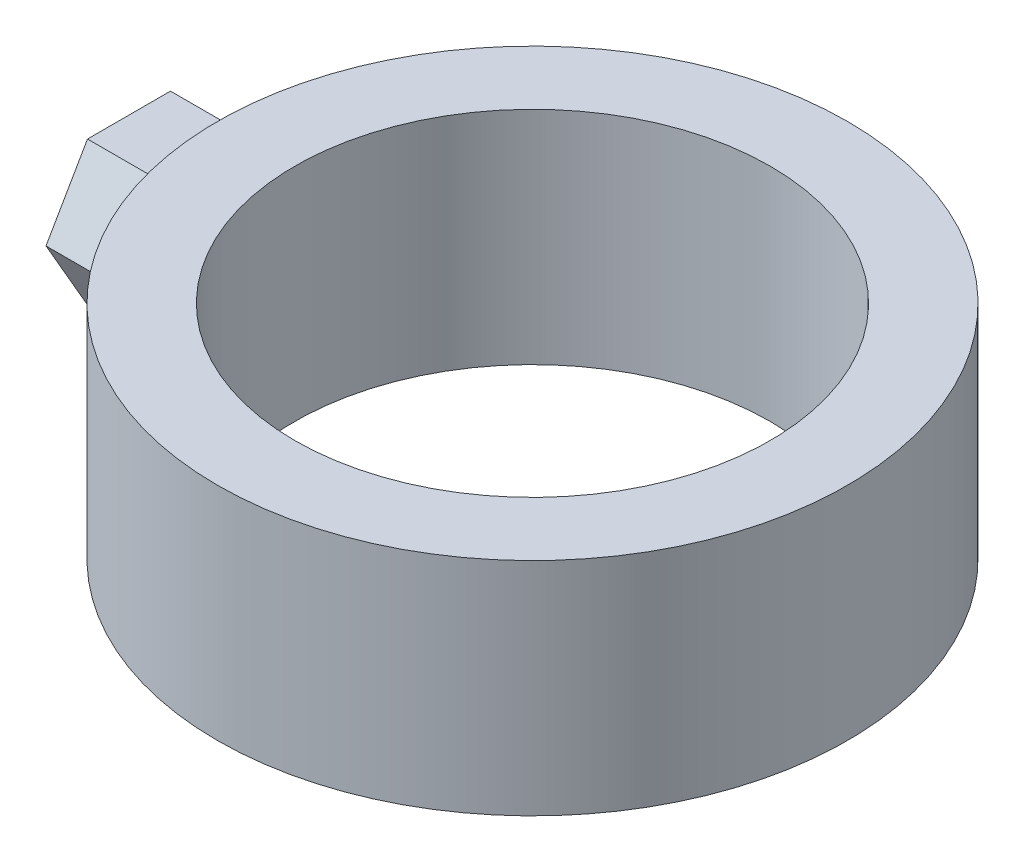
ISO-10303-21;
HEADER;
FILE_DESCRIPTION(('STEP AP214'),'2;1');
FILE_NAME('part.step','',(''),(''),'','','');
FILE_SCHEMA(('AUTOMOTIVE_DESIGN { 1 0 10303 214 1 1 1 1 }'));
ENDSEC;
DATA;
#1=APPLICATION_CONTEXT('core data for automotive mechanical design processes');
#2=APPLICATION_PROTOCOL_DEFINITION('international standard','automotive_design',2000,#1);
#3=PRODUCT_CONTEXT('',#1,'mechanical');
#4=PRODUCT('Part','Part','',(#3));
#5=PRODUCT_RELATED_PRODUCT_CATEGORY('part','',(#4));
#6=PRODUCT_DEFINITION_FORMATION('','',#4);
#7=PRODUCT_DEFINITION_CONTEXT('part definition',#1,'design');
#8=PRODUCT_DEFINITION('design','',#6,#7);
#9=PRODUCT_DEFINITION_SHAPE('','',#8);
#10=(LENGTH_UNIT() NAMED_UNIT(*) SI_UNIT(.MILLI.,.METRE.));
#11=(NAMED_UNIT(*) PLANE_ANGLE_UNIT() SI_UNIT($,.RADIAN.));
#12=(NAMED_UNIT(*) SI_UNIT($,.STERADIAN.) SOLID_ANGLE_UNIT());
#13=UNCERTAINTY_MEASURE_WITH_UNIT(LENGTH_MEASURE(1.E-05),#10,'distance_accuracy_value','');
#14=(GEOMETRIC_REPRESENTATION_CONTEXT(3) GLOBAL_UNCERTAINTY_ASSIGNED_CONTEXT((#13)) GLOBAL_UNIT_ASSIGNED_CONTEXT((#10,
#11,#12)) REPRESENTATION_CONTEXT('',''));
#15=CARTESIAN_POINT('',(0.,0.,0.));
#16=DIRECTION('',(0.,0.,1.));
#17=DIRECTION('',(1.,0.,0.));
#18=AXIS2_PLACEMENT_3D('',#15,#16,#17);
#19=CARTESIAN_POINT('',(0.,10.,0.));
#20=DIRECTION('',(0.,1.,0.));
#21=DIRECTION('',(0.,0.,1.));
#22=AXIS2_PLACEMENT_3D('',#19,#20,#21);
#23=PLANE('',#22);
#24=CARTESIAN_POINT('',(0.,10.,0.));
#25=DIRECTION('',(0.,1.,0.));
#26=DIRECTION('',(0.,0.,1.));
#27=AXIS2_PLACEMENT_3D('',#24,#25,#26);
#28=CIRCLE('',#27,28.5);
#29=CARTESIAN_POINT('',(0.,10.,28.5));
#30=VERTEX_POINT('',#29);
#31=EDGE_CURVE('E139',#30,#30,#28,.T.);
#32=ORIENTED_EDGE('',*,*,#31,.T.);
#33=EDGE_LOOP('',(#32));
#34=FACE_BOUND('',#33,.T.);
#35=CARTESIAN_POINT('',(0.,10.,0.));
#36=DIRECTION('',(0.,1.,0.));
#37=DIRECTION('',(0.,0.,1.));
#38=AXIS2_PLACEMENT_3D('',#35,#36,#37);
#39=CIRCLE('',#38,21.5);
#40=CARTESIAN_POINT('',(0.,10.,21.5));
#41=VERTEX_POINT('',#40);
#42=EDGE_CURVE('E133',#41,#41,#39,.T.);
#43=ORIENTED_EDGE('',*,*,#42,.F.);
#44=EDGE_LOOP('',(#43));
#45=FACE_BOUND('',#44,.T.);
#46=ADVANCED_FACE('F35',(#34,#45),#23,.T.);
#47=CARTESIAN_POINT('',(0.,-10.,0.));
#48=DIRECTION('',(0.,1.,0.));
#49=DIRECTION('',(0.,0.,1.));
#50=AXIS2_PLACEMENT_3D('',#47,#48,#49);
#51=PLANE('',#50);
#52=CARTESIAN_POINT('',(0.,-10.,0.));
#53=DIRECTION('',(0.,1.,0.));
#54=DIRECTION('',(0.,0.,1.));
#55=AXIS2_PLACEMENT_3D('',#52,#53,#54);
#56=CIRCLE('',#55,28.5);
#57=CARTESIAN_POINT('',(0.,-10.,28.5));
#58=VERTEX_POINT('',#57);
#59=EDGE_CURVE('E136',#58,#58,#56,.T.);
#60=ORIENTED_EDGE('',*,*,#59,.F.);
#61=EDGE_LOOP('',(#60));
#62=FACE_BOUND('',#61,.T.);
#63=CARTESIAN_POINT('',(0.,-10.,0.));
#64=DIRECTION('',(0.,1.,0.));
#65=DIRECTION('',(0.,0.,1.));
#66=AXIS2_PLACEMENT_3D('',#63,#64,#65);
#67=CIRCLE('',#66,21.5);
#68=CARTESIAN_POINT('',(0.,-10.,21.5));
#69=VERTEX_POINT('',#68);
#70=EDGE_CURVE('E122',#69,#69,#67,.T.);
#71=ORIENTED_EDGE('',*,*,#70,.T.);
#72=EDGE_LOOP('',(#71));
#73=FACE_BOUND('',#72,.T.);
#74=ADVANCED_FACE('F174',(#62,#73),#51,.F.);
#75=CARTESIAN_POINT('',(0.,10.,0.));
#76=DIRECTION('',(0.,-1.,0.));
#77=DIRECTION('',(0.,0.,-1.));
#78=AXIS2_PLACEMENT_3D('',#75,#76,#77);
#79=CYLINDRICAL_SURFACE('',#78,28.5);
#80=CARTESIAN_POINT('',(0.,-6.5,0.));
#81=DIRECTION('',(0.,-1.,0.));
#82=DIRECTION('',(0.,0.,-1.));
#83=AXIS2_PLACEMENT_3D('',#80,#81,#82);
#84=CIRCLE('',#83,28.5);
#85=CARTESIAN_POINT('',(-28.2518435976604,-6.5,3.75277674973257));
#86=VERTEX_POINT('',#85);
#87=CARTESIAN_POINT('',(-28.2518435976604,-6.5,-3.75277674973257));
#88=VERTEX_POINT('',#87);
#89=EDGE_CURVE('E43',#86,#88,#84,.T.);
#90=ORIENTED_EDGE('',*,*,#89,.T.);
#91=CARTESIAN_POINT('',(0.,-13.,0.));
#92=DIRECTION('',(0.,-0.5,-0.866025403784439));
#93=DIRECTION('',(0.,-0.866025403784439,0.5));
#94=AXIS2_PLACEMENT_3D('',#91,#92,#93);
#95=ELLIPSE('',#94,57.,28.5);
#96=CARTESIAN_POINT('',(-27.4939387259568,0.,-7.50555349946513));
#97=VERTEX_POINT('',#96);
#98=EDGE_CURVE('E11',#88,#97,#95,.T.);
#99=ORIENTED_EDGE('',*,*,#98,.T.);
#100=CARTESIAN_POINT('',(0.,13.,0.));
#101=DIRECTION('',(0.,0.5,-0.866025403784438));
#102=DIRECTION('',(0.,-0.866025403784439,-0.5));
#103=AXIS2_PLACEMENT_3D('',#100,#101,#102);
#104=ELLIPSE('',#103,57.,28.5);
#105=CARTESIAN_POINT('',(-28.2518435976604,6.5,-3.75277674973257));
#106=VERTEX_POINT('',#105);
#107=EDGE_CURVE('E89',#97,#106,#104,.T.);
#108=ORIENTED_EDGE('',*,*,#107,.T.);
#109=CARTESIAN_POINT('',(0.,6.5,0.));
#110=DIRECTION('',(0.,1.,0.));
#111=DIRECTION('',(0.,0.,1.));
#112=AXIS2_PLACEMENT_3D('',#109,#110,#111);
#113=CIRCLE('',#112,28.5);
#114=CARTESIAN_POINT('',(-28.2518435976604,6.5,3.75277674973257));
#115=VERTEX_POINT('',#114);
#116=EDGE_CURVE('E145',#106,#115,#113,.T.);
#117=ORIENTED_EDGE('',*,*,#116,.T.);
#118=CARTESIAN_POINT('',(0.,13.,0.));
#119=DIRECTION('',(0.,0.5,0.866025403784439));
#120=DIRECTION('',(0.,-0.866025403784439,0.5));
#121=AXIS2_PLACEMENT_3D('',#118,#119,#120);
#122=ELLIPSE('',#121,57.,28.5);
#123=CARTESIAN_POINT('',(-27.4939387259568,0.,7.50555349946513));
#124=VERTEX_POINT('',#123);
#125=EDGE_CURVE('E148',#115,#124,#122,.T.);
#126=ORIENTED_EDGE('',*,*,#125,.T.);
#127=CARTESIAN_POINT('',(0.,-13.,0.));
#128=DIRECTION('',(0.,-0.5,0.866025403784439));
#129=DIRECTION('',(0.,-0.866025403784439,-0.5));
#130=AXIS2_PLACEMENT_3D('',#127,#128,#129);
#131=ELLIPSE('',#130,57.,28.5);
#132=EDGE_CURVE('E151',#124,#86,#131,.T.);
#133=ORIENTED_EDGE('',*,*,#132,.T.);
#134=EDGE_LOOP('',(#90,#99,#108,#117,#126,#133));
#135=FACE_BOUND('',#134,.T.);
#136=ORIENTED_EDGE('',*,*,#31,.F.);
#137=EDGE_LOOP('',(#136));
#138=FACE_BOUND('',#137,.T.);
#139=ORIENTED_EDGE('',*,*,#59,.T.);
#140=EDGE_LOOP('',(#139));
#141=FACE_BOUND('',#140,.T.);
#142=ADVANCED_FACE('F37',(#135,#138,#141),#79,.T.);
#143=CARTESIAN_POINT('',(0.,10.,0.));
#144=DIRECTION('',(0.,-1.,0.));
#145=DIRECTION('',(0.,0.,-1.));
#146=AXIS2_PLACEMENT_3D('',#143,#144,#145);
#147=CYLINDRICAL_SURFACE('',#146,21.5);
#148=ORIENTED_EDGE('',*,*,#42,.T.);
#149=EDGE_LOOP('',(#148));
#150=FACE_BOUND('',#149,.T.);
#151=ORIENTED_EDGE('',*,*,#70,.F.);
#152=EDGE_LOOP('',(#151));
#153=FACE_BOUND('',#152,.T.);
#154=ADVANCED_FACE('F183',(#150,#153),#147,.F.);
#155=CARTESIAN_POINT('',(-36.5,-6.5,-3.75277674973257));
#156=DIRECTION('',(0.,-0.5,-0.866025403784439));
#157=DIRECTION('',(0.,0.866025403784439,-0.5));
#158=AXIS2_PLACEMENT_3D('',#155,#156,#157);
#159=PLANE('',#158);
#160=ORIENTED_EDGE('',*,*,#98,.F.);
#161=DIRECTION('',(1.,0.,0.));
#162=VECTOR('',#161,1.);
#163=CARTESIAN_POINT('',(-36.5,-6.5,-3.75277674973257));
#164=LINE('',#163,#162);
#165=CARTESIAN_POINT('',(-36.5,-6.5,-3.75277674973257));
#166=VERTEX_POINT('',#165);
#167=EDGE_CURVE('E105',#166,#88,#164,.T.);
#168=ORIENTED_EDGE('',*,*,#167,.F.);
#169=DIRECTION('',(0.,0.866025403784439,-0.5));
#170=VECTOR('',#169,1.);
#171=CARTESIAN_POINT('',(-36.5,-6.5,-3.75277674973257));
#172=LINE('',#171,#170);
#173=CARTESIAN_POINT('',(-36.5,0.,-7.50555349946513));
#174=VERTEX_POINT('',#173);
#175=EDGE_CURVE('E98',#166,#174,#172,.T.);
#176=ORIENTED_EDGE('',*,*,#175,.T.);
#177=DIRECTION('',(1.,0.,0.));
#178=VECTOR('',#177,1.);
#179=CARTESIAN_POINT('',(-36.5,0.,-7.50555349946513));
#180=LINE('',#179,#178);
#181=EDGE_CURVE('E84',#174,#97,#180,.T.);
#182=ORIENTED_EDGE('',*,*,#181,.T.);
#183=EDGE_LOOP('',(#160,#168,#176,#182));
#184=FACE_BOUND('',#183,.T.);
#185=ADVANCED_FACE('F104',(#184),#159,.T.);
#186=CARTESIAN_POINT('',(-36.5,-6.5,3.75277674973257));
#187=DIRECTION('',(0.,-1.,0.));
#188=DIRECTION('',(0.,0.,-1.));
#189=AXIS2_PLACEMENT_3D('',#186,#187,#188);
#190=PLANE('',#189);
#191=ORIENTED_EDGE('',*,*,#89,.F.);
#192=DIRECTION('',(1.,0.,0.));
#193=VECTOR('',#192,1.);
#194=CARTESIAN_POINT('',(-36.5,-6.5,3.75277674973257));
#195=LINE('',#194,#193);
#196=CARTESIAN_POINT('',(-36.5,-6.5,3.75277674973257));
#197=VERTEX_POINT('',#196);
#198=EDGE_CURVE('E123',#197,#86,#195,.T.);
#199=ORIENTED_EDGE('',*,*,#198,.F.);
#200=DIRECTION('',(0.,0.,-1.));
#201=VECTOR('',#200,1.);
#202=CARTESIAN_POINT('',(-36.5,-6.5,3.75277674973257));
#203=LINE('',#202,#201);
#204=EDGE_CURVE('E91',#197,#166,#203,.T.);
#205=ORIENTED_EDGE('',*,*,#204,.T.);
#206=ORIENTED_EDGE('',*,*,#167,.T.);
#207=EDGE_LOOP('',(#191,#199,#205,#206));
#208=FACE_BOUND('',#207,.T.);
#209=ADVANCED_FACE('F157',(#208),#190,.T.);
#210=CARTESIAN_POINT('',(-36.5,0.,7.50555349946513));
#211=DIRECTION('',(0.,-0.5,0.866025403784439));
#212=DIRECTION('',(0.,-0.866025403784439,-0.5));
#213=AXIS2_PLACEMENT_3D('',#210,#211,#212);
#214=PLANE('',#213);
#215=ORIENTED_EDGE('',*,*,#132,.F.);
#216=DIRECTION('',(1.,0.,0.));
#217=VECTOR('',#216,1.);
#218=CARTESIAN_POINT('',(-36.5,0.,7.50555349946513));
#219=LINE('',#218,#217);
#220=CARTESIAN_POINT('',(-36.5,0.,7.50555349946513));
#221=VERTEX_POINT('',#220);
#222=EDGE_CURVE('E126',#221,#124,#219,.T.);
#223=ORIENTED_EDGE('',*,*,#222,.F.);
#224=DIRECTION('',(0.,-0.866025403784439,-0.5));
#225=VECTOR('',#224,1.);
#226=CARTESIAN_POINT('',(-36.5,0.,7.50555349946513));
#227=LINE('',#226,#225);
#228=EDGE_CURVE('E117',#221,#197,#227,.T.);
#229=ORIENTED_EDGE('',*,*,#228,.T.);
#230=ORIENTED_EDGE('',*,*,#198,.T.);
#231=EDGE_LOOP('',(#215,#223,#229,#230));
#232=FACE_BOUND('',#231,.T.);
#233=ADVANCED_FACE('F159',(#232),#214,.T.);
#234=CARTESIAN_POINT('',(-36.5,6.5,3.75277674973257));
#235=DIRECTION('',(0.,0.5,0.866025403784439));
#236=DIRECTION('',(0.,-0.866025403784439,0.5));
#237=AXIS2_PLACEMENT_3D('',#234,#235,#236);
#238=PLANE('',#237);
#239=ORIENTED_EDGE('',*,*,#125,.F.);
#240=DIRECTION('',(1.,0.,0.));
#241=VECTOR('',#240,1.);
#242=CARTESIAN_POINT('',(-36.5,6.5,3.75277674973257));
#243=LINE('',#242,#241);
#244=CARTESIAN_POINT('',(-36.5,6.5,3.75277674973257));
#245=VERTEX_POINT('',#244);
#246=EDGE_CURVE('E129',#245,#115,#243,.T.);
#247=ORIENTED_EDGE('',*,*,#246,.F.);
#248=DIRECTION('',(0.,-0.866025403784439,0.5));
#249=VECTOR('',#248,1.);
#250=CARTESIAN_POINT('',(-36.5,6.5,3.75277674973257));
#251=LINE('',#250,#249);
#252=EDGE_CURVE('E114',#245,#221,#251,.T.);
#253=ORIENTED_EDGE('',*,*,#252,.T.);
#254=ORIENTED_EDGE('',*,*,#222,.T.);
#255=EDGE_LOOP('',(#239,#247,#253,#254));
#256=FACE_BOUND('',#255,.T.);
#257=ADVANCED_FACE('F162',(#256),#238,.T.);
#258=CARTESIAN_POINT('',(-36.5,6.5,-3.75277674973257));
#259=DIRECTION('',(0.,1.,0.));
#260=DIRECTION('',(0.,0.,1.));
#261=AXIS2_PLACEMENT_3D('',#258,#259,#260);
#262=PLANE('',#261);
#263=ORIENTED_EDGE('',*,*,#116,.F.);
#264=DIRECTION('',(1.,0.,0.));
#265=VECTOR('',#264,1.);
#266=CARTESIAN_POINT('',(-36.5,6.5,-3.75277674973257));
#267=LINE('',#266,#265);
#268=CARTESIAN_POINT('',(-36.5,6.5,-3.75277674973257));
#269=VERTEX_POINT('',#268);
#270=EDGE_CURVE('E50',#269,#106,#267,.T.);
#271=ORIENTED_EDGE('',*,*,#270,.F.);
#272=DIRECTION('',(0.,0.,1.));
#273=VECTOR('',#272,1.);
#274=CARTESIAN_POINT('',(-36.5,6.5,-3.75277674973257));
#275=LINE('',#274,#273);
#276=EDGE_CURVE('E102',#269,#245,#275,.T.);
#277=ORIENTED_EDGE('',*,*,#276,.T.);
#278=ORIENTED_EDGE('',*,*,#246,.T.);
#279=EDGE_LOOP('',(#263,#271,#277,#278));
#280=FACE_BOUND('',#279,.T.);
#281=ADVANCED_FACE('F164',(#280),#262,.T.);
#282=CARTESIAN_POINT('',(-36.5,0.,-7.50555349946513));
#283=DIRECTION('',(0.,0.5,-0.866025403784438));
#284=DIRECTION('',(0.,0.866025403784439,0.5));
#285=AXIS2_PLACEMENT_3D('',#282,#283,#284);
#286=PLANE('',#285);
#287=ORIENTED_EDGE('',*,*,#107,.F.);
#288=ORIENTED_EDGE('',*,*,#181,.F.);
#289=DIRECTION('',(0.,0.866025403784438,0.5));
#290=VECTOR('',#289,1.);
#291=CARTESIAN_POINT('',(-36.5,0.,-7.50555349946513));
#292=LINE('',#291,#290);
#293=EDGE_CURVE('E87',#174,#269,#292,.T.);
#294=ORIENTED_EDGE('',*,*,#293,.T.);
#295=ORIENTED_EDGE('',*,*,#270,.T.);
#296=EDGE_LOOP('',(#287,#288,#294,#295));
#297=FACE_BOUND('',#296,.T.);
#298=ADVANCED_FACE('F86',(#297),#286,.T.);
#299=CARTESIAN_POINT('',(-36.5,0.,0.));
#300=DIRECTION('',(1.,0.,0.));
#301=DIRECTION('',(0.,0.,-1.));
#302=AXIS2_PLACEMENT_3D('',#299,#300,#301);
#303=PLANE('',#302);
#304=CARTESIAN_POINT('',(-36.5,0.,0.));
#305=DIRECTION('',(-1.,0.,0.));
#306=DIRECTION('',(0.,0.,1.));
#307=AXIS2_PLACEMENT_3D('',#304,#305,#306);
#308=CIRCLE('',#307,4.);
#309=CARTESIAN_POINT('',(-36.5,0.,4.));
#310=VERTEX_POINT('',#309);
#311=EDGE_CURVE('E109',#310,#310,#308,.T.);
#312=ORIENTED_EDGE('',*,*,#311,.F.);
#313=EDGE_LOOP('',(#312));
#314=FACE_BOUND('',#313,.T.);
#315=ORIENTED_EDGE('',*,*,#175,.F.);
#316=ORIENTED_EDGE('',*,*,#204,.F.);
#317=ORIENTED_EDGE('',*,*,#228,.F.);
#318=ORIENTED_EDGE('',*,*,#252,.F.);
#319=ORIENTED_EDGE('',*,*,#276,.F.);
#320=ORIENTED_EDGE('',*,*,#293,.F.);
#321=EDGE_LOOP('',(#315,#316,#317,#318,#319,#320));
#322=FACE_BOUND('',#321,.T.);
#323=ADVANCED_FACE('F96',(#314,#322),#303,.F.);
#324=CARTESIAN_POINT('',(-31.5,0.,0.));
#325=DIRECTION('',(-1.,0.,0.));
#326=DIRECTION('',(0.,0.,1.));
#327=AXIS2_PLACEMENT_3D('',#324,#325,#326);
#328=CYLINDRICAL_SURFACE('',#327,4.);
#329=CARTESIAN_POINT('',(-31.5,0.,0.));
#330=DIRECTION('',(-1.,0.,0.));
#331=DIRECTION('',(0.,0.,1.));
#332=AXIS2_PLACEMENT_3D('',#329,#330,#331);
#333=CIRCLE('',#332,4.);
#334=CARTESIAN_POINT('',(-31.5,0.,4.));
#335=VERTEX_POINT('',#334);
#336=EDGE_CURVE('E106',#335,#335,#333,.T.);
#337=ORIENTED_EDGE('',*,*,#336,.F.);
#338=EDGE_LOOP('',(#337));
#339=FACE_BOUND('',#338,.T.);
#340=ORIENTED_EDGE('',*,*,#311,.T.);
#341=EDGE_LOOP('',(#340));
#342=FACE_BOUND('',#341,.T.);
#343=ADVANCED_FACE('F199',(#339,#342),#328,.F.);
#344=CARTESIAN_POINT('',(-31.5,0.,0.));
#345=DIRECTION('',(-1.,0.,0.));
#346=DIRECTION('',(0.,0.,1.));
#347=AXIS2_PLACEMENT_3D('',#344,#345,#346);
#348=PLANE('',#347);
#349=ORIENTED_EDGE('',*,*,#336,.T.);
#350=EDGE_LOOP('',(#349));
#351=FACE_BOUND('',#350,.T.);
#352=ADVANCED_FACE('F203',(#351),#348,.T.);
#353=CLOSED_SHELL('',(#46,#74,#142,#154,#185,#209,#233,#257,#281,#298,#323,#343,#352));
#354=MANIFOLD_SOLID_BREP('B2',#353);
#355=ADVANCED_BREP_SHAPE_REPRESENTATION('',(#18,#354),#14);
#356=SHAPE_DEFINITION_REPRESENTATION(#9,#355);
ENDSEC;
END-ISO-10303-21;
